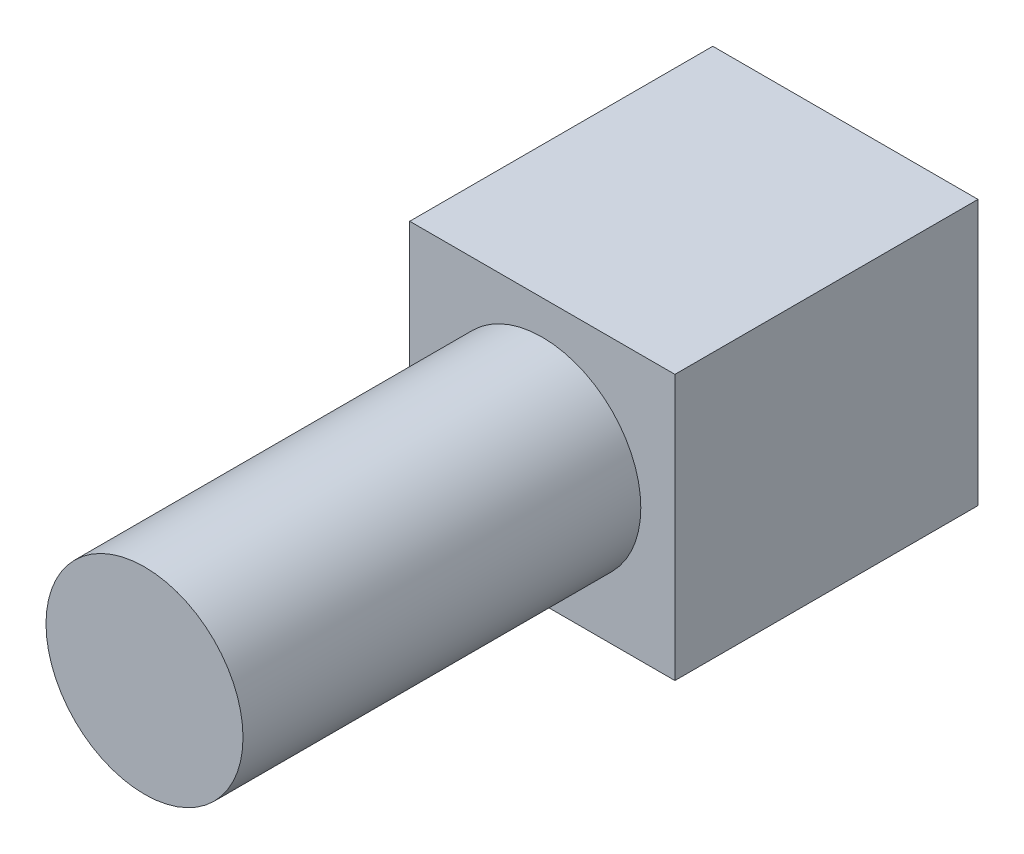
ISO-10303-21;
HEADER;
FILE_DESCRIPTION(('STEP AP214'),'2;1');
FILE_NAME('part.step','',(''),(''),'','','');
FILE_SCHEMA(('AUTOMOTIVE_DESIGN { 1 0 10303 214 1 1 1 1 }'));
ENDSEC;
DATA;
#1=APPLICATION_CONTEXT('core data for automotive mechanical design processes');
#2=APPLICATION_PROTOCOL_DEFINITION('international standard','automotive_design',2000,#1);
#3=PRODUCT_CONTEXT('',#1,'mechanical');
#4=PRODUCT('Part','Part','',(#3));
#5=PRODUCT_RELATED_PRODUCT_CATEGORY('part','',(#4));
#6=PRODUCT_DEFINITION_FORMATION('','',#4);
#7=PRODUCT_DEFINITION_CONTEXT('part definition',#1,'design');
#8=PRODUCT_DEFINITION('design','',#6,#7);
#9=PRODUCT_DEFINITION_SHAPE('','',#8);
#10=(LENGTH_UNIT() NAMED_UNIT(*) SI_UNIT(.MILLI.,.METRE.));
#11=(NAMED_UNIT(*) PLANE_ANGLE_UNIT() SI_UNIT($,.RADIAN.));
#12=(NAMED_UNIT(*) SI_UNIT($,.STERADIAN.) SOLID_ANGLE_UNIT());
#13=UNCERTAINTY_MEASURE_WITH_UNIT(LENGTH_MEASURE(1.E-05),#10,'distance_accuracy_value','');
#14=(GEOMETRIC_REPRESENTATION_CONTEXT(3) GLOBAL_UNCERTAINTY_ASSIGNED_CONTEXT((#13)) GLOBAL_UNIT_ASSIGNED_CONTEXT((#10,
#11,#12)) REPRESENTATION_CONTEXT('',''));
#15=CARTESIAN_POINT('',(0.,0.,0.));
#16=DIRECTION('',(0.,0.,1.));
#17=DIRECTION('',(1.,0.,0.));
#18=AXIS2_PLACEMENT_3D('',#15,#16,#17);
#19=CARTESIAN_POINT('',(3.5,-3.5,-8.));
#20=DIRECTION('',(1.,0.,0.));
#21=DIRECTION('',(0.,0.,-1.));
#22=AXIS2_PLACEMENT_3D('',#19,#20,#21);
#23=PLANE('',#22);
#24=DIRECTION('',(0.,1.,0.));
#25=VECTOR('',#24,1.);
#26=CARTESIAN_POINT('',(3.5,-3.5,0.));
#27=LINE('',#26,#25);
#28=CARTESIAN_POINT('',(3.5,-3.5,0.));
#29=VERTEX_POINT('',#28);
#30=CARTESIAN_POINT('',(3.5,3.5,0.));
#31=VERTEX_POINT('',#30);
#32=EDGE_CURVE('E111',#29,#31,#27,.T.);
#33=ORIENTED_EDGE('',*,*,#32,.F.);
#34=DIRECTION('',(0.,0.,1.));
#35=VECTOR('',#34,1.);
#36=CARTESIAN_POINT('',(3.5,-3.5,-8.));
#37=LINE('',#36,#35);
#38=CARTESIAN_POINT('',(3.5,-3.5,-8.));
#39=VERTEX_POINT('',#38);
#40=EDGE_CURVE('E49',#39,#29,#37,.T.);
#41=ORIENTED_EDGE('',*,*,#40,.F.);
#42=DIRECTION('',(0.,1.,0.));
#43=VECTOR('',#42,1.);
#44=CARTESIAN_POINT('',(3.5,-3.5,-8.));
#45=LINE('',#44,#43);
#46=CARTESIAN_POINT('',(3.5,3.5,-8.));
#47=VERTEX_POINT('',#46);
#48=EDGE_CURVE('E103',#39,#47,#45,.T.);
#49=ORIENTED_EDGE('',*,*,#48,.T.);
#50=DIRECTION('',(0.,0.,1.));
#51=VECTOR('',#50,1.);
#52=CARTESIAN_POINT('',(3.5,3.5,-8.));
#53=LINE('',#52,#51);
#54=EDGE_CURVE('E42',#47,#31,#53,.T.);
#55=ORIENTED_EDGE('',*,*,#54,.T.);
#56=EDGE_LOOP('',(#33,#41,#49,#55));
#57=FACE_BOUND('',#56,.T.);
#58=ADVANCED_FACE('F39',(#57),#23,.T.);
#59=CARTESIAN_POINT('',(-3.5,-3.5,-8.));
#60=DIRECTION('',(0.,-1.,0.));
#61=DIRECTION('',(0.,0.,-1.));
#62=AXIS2_PLACEMENT_3D('',#59,#60,#61);
#63=PLANE('',#62);
#64=DIRECTION('',(1.,0.,0.));
#65=VECTOR('',#64,1.);
#66=CARTESIAN_POINT('',(-3.5,-3.5,0.));
#67=LINE('',#66,#65);
#68=CARTESIAN_POINT('',(-3.5,-3.5,0.));
#69=VERTEX_POINT('',#68);
#70=EDGE_CURVE('E106',#69,#29,#67,.T.);
#71=ORIENTED_EDGE('',*,*,#70,.F.);
#72=DIRECTION('',(0.,0.,1.));
#73=VECTOR('',#72,1.);
#74=CARTESIAN_POINT('',(-3.5,-3.5,-8.));
#75=LINE('',#74,#73);
#76=CARTESIAN_POINT('',(-3.5,-3.5,-8.));
#77=VERTEX_POINT('',#76);
#78=EDGE_CURVE('E74',#77,#69,#75,.T.);
#79=ORIENTED_EDGE('',*,*,#78,.F.);
#80=DIRECTION('',(1.,0.,0.));
#81=VECTOR('',#80,1.);
#82=CARTESIAN_POINT('',(-3.5,-3.5,-8.));
#83=LINE('',#82,#81);
#84=EDGE_CURVE('E98',#77,#39,#83,.T.);
#85=ORIENTED_EDGE('',*,*,#84,.T.);
#86=ORIENTED_EDGE('',*,*,#40,.T.);
#87=EDGE_LOOP('',(#71,#79,#85,#86));
#88=FACE_BOUND('',#87,.T.);
#89=ADVANCED_FACE('F130',(#88),#63,.T.);
#90=CARTESIAN_POINT('',(-3.5,-3.5,-8.));
#91=DIRECTION('',(-1.,0.,0.));
#92=DIRECTION('',(0.,0.,1.));
#93=AXIS2_PLACEMENT_3D('',#90,#91,#92);
#94=PLANE('',#93);
#95=DIRECTION('',(0.,-1.,0.));
#96=VECTOR('',#95,1.);
#97=CARTESIAN_POINT('',(-3.5,-3.5,0.));
#98=LINE('',#97,#96);
#99=CARTESIAN_POINT('',(-3.5,3.5,0.));
#100=VERTEX_POINT('',#99);
#101=EDGE_CURVE('E92',#100,#69,#98,.T.);
#102=ORIENTED_EDGE('',*,*,#101,.F.);
#103=DIRECTION('',(0.,0.,1.));
#104=VECTOR('',#103,1.);
#105=CARTESIAN_POINT('',(-3.5,3.5,-8.));
#106=LINE('',#105,#104);
#107=CARTESIAN_POINT('',(-3.5,3.5,-8.));
#108=VERTEX_POINT('',#107);
#109=EDGE_CURVE('E87',#108,#100,#106,.T.);
#110=ORIENTED_EDGE('',*,*,#109,.F.);
#111=DIRECTION('',(0.,-1.,0.));
#112=VECTOR('',#111,1.);
#113=CARTESIAN_POINT('',(-3.5,-3.5,-8.));
#114=LINE('',#113,#112);
#115=EDGE_CURVE('E90',#108,#77,#114,.T.);
#116=ORIENTED_EDGE('',*,*,#115,.T.);
#117=ORIENTED_EDGE('',*,*,#78,.T.);
#118=EDGE_LOOP('',(#102,#110,#116,#117));
#119=FACE_BOUND('',#118,.T.);
#120=ADVANCED_FACE('F89',(#119),#94,.T.);
#121=CARTESIAN_POINT('',(-3.5,3.5,-8.));
#122=DIRECTION('',(0.,1.,0.));
#123=DIRECTION('',(0.,0.,1.));
#124=AXIS2_PLACEMENT_3D('',#121,#122,#123);
#125=PLANE('',#124);
#126=DIRECTION('',(-1.,0.,0.));
#127=VECTOR('',#126,1.);
#128=CARTESIAN_POINT('',(-3.5,3.5,0.));
#129=LINE('',#128,#127);
#130=EDGE_CURVE('E115',#31,#100,#129,.T.);
#131=ORIENTED_EDGE('',*,*,#130,.F.);
#132=ORIENTED_EDGE('',*,*,#54,.F.);
#133=DIRECTION('',(-1.,0.,0.));
#134=VECTOR('',#133,1.);
#135=CARTESIAN_POINT('',(-3.5,3.5,-8.));
#136=LINE('',#135,#134);
#137=EDGE_CURVE('E97',#47,#108,#136,.T.);
#138=ORIENTED_EDGE('',*,*,#137,.T.);
#139=ORIENTED_EDGE('',*,*,#109,.T.);
#140=EDGE_LOOP('',(#131,#132,#138,#139));
#141=FACE_BOUND('',#140,.T.);
#142=ADVANCED_FACE('F101',(#141),#125,.T.);
#143=CARTESIAN_POINT('',(0.,0.,-8.));
#144=DIRECTION('',(0.,0.,-1.));
#145=DIRECTION('',(-1.,0.,0.));
#146=AXIS2_PLACEMENT_3D('',#143,#144,#145);
#147=PLANE('',#146);
#148=ORIENTED_EDGE('',*,*,#48,.F.);
#149=ORIENTED_EDGE('',*,*,#84,.F.);
#150=ORIENTED_EDGE('',*,*,#115,.F.);
#151=ORIENTED_EDGE('',*,*,#137,.F.);
#152=EDGE_LOOP('',(#148,#149,#150,#151));
#153=FACE_BOUND('',#152,.T.);
#154=ADVANCED_FACE('F96',(#153),#147,.T.);
#155=CARTESIAN_POINT('',(0.,0.,0.));
#156=DIRECTION('',(0.,0.,-1.));
#157=DIRECTION('',(-1.,0.,0.));
#158=AXIS2_PLACEMENT_3D('',#155,#156,#157);
#159=PLANE('',#158);
#160=CARTESIAN_POINT('',(0.,0.,0.));
#161=DIRECTION('',(0.,0.,1.));
#162=DIRECTION('',(1.,0.,0.));
#163=AXIS2_PLACEMENT_3D('',#160,#161,#162);
#164=CIRCLE('',#163,2.6);
#165=CARTESIAN_POINT('',(-2.6,0.,0.));
#166=VERTEX_POINT('',#165);
#167=EDGE_CURVE('E11',#166,#166,#164,.T.);
#168=ORIENTED_EDGE('',*,*,#167,.F.);
#169=EDGE_LOOP('',(#168));
#170=FACE_BOUND('',#169,.T.);
#171=ORIENTED_EDGE('',*,*,#32,.T.);
#172=ORIENTED_EDGE('',*,*,#130,.T.);
#173=ORIENTED_EDGE('',*,*,#101,.T.);
#174=ORIENTED_EDGE('',*,*,#70,.T.);
#175=EDGE_LOOP('',(#171,#172,#173,#174));
#176=FACE_BOUND('',#175,.T.);
#177=ADVANCED_FACE('F129',(#170,#176),#159,.F.);
#178=CARTESIAN_POINT('',(0.,0.,10.5));
#179=DIRECTION('',(0.,0.,-1.));
#180=DIRECTION('',(-1.,0.,0.));
#181=AXIS2_PLACEMENT_3D('',#178,#179,#180);
#182=CYLINDRICAL_SURFACE('',#181,2.6);
#183=CARTESIAN_POINT('',(0.,0.,10.5));
#184=DIRECTION('',(0.,0.,1.));
#185=DIRECTION('',(1.,0.,0.));
#186=AXIS2_PLACEMENT_3D('',#183,#184,#185);
#187=CIRCLE('',#186,2.6);
#188=CARTESIAN_POINT('',(-2.6,0.,10.5));
#189=VERTEX_POINT('',#188);
#190=EDGE_CURVE('E116',#189,#189,#187,.T.);
#191=CARTESIAN_POINT('',(-2.6,0.,10.5));
#192=CARTESIAN_POINT('',(-2.6,0.,10.390625));
#193=CARTESIAN_POINT('',(-2.6,0.,10.28125));
#194=CARTESIAN_POINT('',(-2.6,0.,10.0625));
#195=CARTESIAN_POINT('',(-2.6,0.,9.953125));
#196=CARTESIAN_POINT('',(-2.6,0.,9.734375));
#197=CARTESIAN_POINT('',(-2.6,0.,9.625));
#198=CARTESIAN_POINT('',(-2.6,0.,9.40625));
#199=CARTESIAN_POINT('',(-2.6,0.,9.296875));
#200=CARTESIAN_POINT('',(-2.6,0.,9.078125));
#201=CARTESIAN_POINT('',(-2.6,0.,8.96875));
#202=CARTESIAN_POINT('',(-2.6,0.,8.75));
#203=CARTESIAN_POINT('',(-2.6,0.,8.640625));
#204=CARTESIAN_POINT('',(-2.6,0.,8.421875));
#205=CARTESIAN_POINT('',(-2.6,0.,8.3125));
#206=CARTESIAN_POINT('',(-2.6,0.,8.09375));
#207=CARTESIAN_POINT('',(-2.6,0.,7.984375));
#208=CARTESIAN_POINT('',(-2.6,0.,7.765625));
#209=CARTESIAN_POINT('',(-2.6,0.,7.65625));
#210=CARTESIAN_POINT('',(-2.6,0.,7.4375));
#211=CARTESIAN_POINT('',(-2.6,0.,7.328125));
#212=CARTESIAN_POINT('',(-2.6,0.,7.109375));
#213=CARTESIAN_POINT('',(-2.6,0.,7.));
#214=CARTESIAN_POINT('',(-2.6,0.,6.78125));
#215=CARTESIAN_POINT('',(-2.6,0.,6.671875));
#216=CARTESIAN_POINT('',(-2.6,0.,6.453125));
#217=CARTESIAN_POINT('',(-2.6,0.,6.34375));
#218=CARTESIAN_POINT('',(-2.6,0.,6.125));
#219=CARTESIAN_POINT('',(-2.6,0.,6.015625));
#220=CARTESIAN_POINT('',(-2.6,0.,5.796875));
#221=CARTESIAN_POINT('',(-2.6,0.,5.6875));
#222=CARTESIAN_POINT('',(-2.6,0.,5.46875));
#223=CARTESIAN_POINT('',(-2.6,0.,5.359375));
#224=CARTESIAN_POINT('',(-2.6,0.,5.140625));
#225=CARTESIAN_POINT('',(-2.6,0.,5.03125));
#226=CARTESIAN_POINT('',(-2.6,0.,4.8125));
#227=CARTESIAN_POINT('',(-2.6,0.,4.703125));
#228=CARTESIAN_POINT('',(-2.6,0.,4.484375));
#229=CARTESIAN_POINT('',(-2.6,0.,4.375));
#230=CARTESIAN_POINT('',(-2.6,0.,4.15625));
#231=CARTESIAN_POINT('',(-2.6,0.,4.046875));
#232=CARTESIAN_POINT('',(-2.6,0.,3.828125));
#233=CARTESIAN_POINT('',(-2.6,0.,3.71875));
#234=CARTESIAN_POINT('',(-2.6,0.,3.5));
#235=CARTESIAN_POINT('',(-2.6,0.,3.390625));
#236=CARTESIAN_POINT('',(-2.6,0.,3.171875));
#237=CARTESIAN_POINT('',(-2.6,0.,3.0625));
#238=CARTESIAN_POINT('',(-2.6,0.,2.84375));
#239=CARTESIAN_POINT('',(-2.6,0.,2.734375));
#240=CARTESIAN_POINT('',(-2.6,0.,2.515625));
#241=CARTESIAN_POINT('',(-2.6,0.,2.40625));
#242=CARTESIAN_POINT('',(-2.6,0.,2.1875));
#243=CARTESIAN_POINT('',(-2.6,0.,2.078125));
#244=CARTESIAN_POINT('',(-2.6,0.,1.859375));
#245=CARTESIAN_POINT('',(-2.6,0.,1.75));
#246=CARTESIAN_POINT('',(-2.6,0.,1.53125));
#247=CARTESIAN_POINT('',(-2.6,0.,1.421875));
#248=CARTESIAN_POINT('',(-2.6,0.,1.203125));
#249=CARTESIAN_POINT('',(-2.6,0.,1.09375));
#250=CARTESIAN_POINT('',(-2.6,0.,0.875000000000001));
#251=CARTESIAN_POINT('',(-2.6,0.,0.765625000000001));
#252=CARTESIAN_POINT('',(-2.6,0.,0.546875));
#253=CARTESIAN_POINT('',(-2.6,0.,0.4375));
#254=CARTESIAN_POINT('',(-2.6,0.,0.21875));
#255=CARTESIAN_POINT('',(-2.6,0.,0.109375));
#256=CARTESIAN_POINT('',(-2.6,0.,0.));
#257=B_SPLINE_CURVE_WITH_KNOTS('',3,(#191,#192,#193,#194,#195,#196,#197,#198,#199,#200,#201,
#202,#203,#204,#205,#206,#207,#208,#209,#210,#211,#212,#213,#214,#215,#216,#217,#218,#219,#220,
#221,#222,#223,#224,#225,#226,#227,#228,#229,#230,#231,#232,#233,#234,#235,#236,#237,#238,#239,
#240,#241,#242,#243,#244,#245,#246,#247,#248,#249,#250,#251,#252,#253,#254,#255,#256),
.UNSPECIFIED.,.F.,.F.,(4,2,2,2,2,2,2,2,2,2,2,2,2,2,2,2,2,2,2,2,2,2,2,2,2,2,2,2,2,2,2,2,4),(0.,
0.328125,0.656250000000001,0.984375000000001,1.3125,1.640625,1.96875,2.296875,2.625,2.953125,
3.28125,3.609375,3.9375,4.265625,4.59375,4.921875,5.25,5.578125,5.90625,6.234375,6.5625,
6.890625,7.21875,7.546875,7.875,8.203125,8.53125,8.859375,9.1875,9.515625,9.84375,10.171875,
10.5),.UNSPECIFIED.);
#258=EDGE_CURVE('BSEAM147',#189,#166,#257,.T.);
#259=ORIENTED_EDGE('',*,*,#190,.F.);
#260=ORIENTED_EDGE('',*,*,#167,.T.);
#261=ORIENTED_EDGE('',*,*,#258,.T.);
#262=ORIENTED_EDGE('',*,*,#258,.F.);
#263=EDGE_LOOP('',(#259,#261,#260,#262));
#264=FACE_BOUND('',#263,.T.);
#265=ADVANCED_FACE('F147',(#264),#182,.T.);
#266=CARTESIAN_POINT('',(0.,0.,10.5));
#267=DIRECTION('',(0.,0.,1.));
#268=DIRECTION('',(1.,0.,0.));
#269=AXIS2_PLACEMENT_3D('',#266,#267,#268);
#270=PLANE('',#269);
#271=ORIENTED_EDGE('',*,*,#190,.T.);
#272=EDGE_LOOP('',(#271));
#273=FACE_BOUND('',#272,.T.);
#274=ADVANCED_FACE('F152',(#273),#270,.T.);
#275=CLOSED_SHELL('',(#58,#89,#120,#142,#154,#177,#265,#274));
#276=MANIFOLD_SOLID_BREP('B2',#275);
#277=ADVANCED_BREP_SHAPE_REPRESENTATION('',(#18,#276),#14);
#278=SHAPE_DEFINITION_REPRESENTATION(#9,#277);
ENDSEC;
END-ISO-10303-21;
